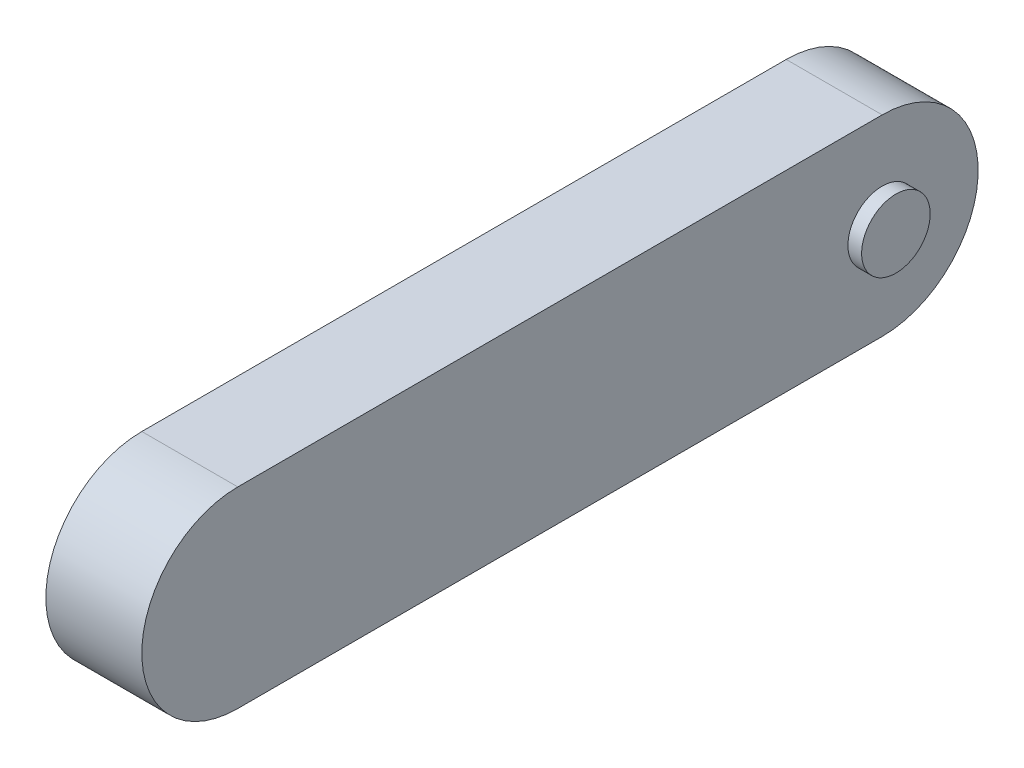
ISO-10303-21;
HEADER;
FILE_DESCRIPTION(('STEP AP214'),'2;1');
FILE_NAME('part.step','',(''),(''),'','','');
FILE_SCHEMA(('AUTOMOTIVE_DESIGN { 1 0 10303 214 1 1 1 1 }'));
ENDSEC;
DATA;
#1=APPLICATION_CONTEXT('core data for automotive mechanical design processes');
#2=APPLICATION_PROTOCOL_DEFINITION('international standard','automotive_design',2000,#1);
#3=PRODUCT_CONTEXT('',#1,'mechanical');
#4=PRODUCT('Part','Part','',(#3));
#5=PRODUCT_RELATED_PRODUCT_CATEGORY('part','',(#4));
#6=PRODUCT_DEFINITION_FORMATION('','',#4);
#7=PRODUCT_DEFINITION_CONTEXT('part definition',#1,'design');
#8=PRODUCT_DEFINITION('design','',#6,#7);
#9=PRODUCT_DEFINITION_SHAPE('','',#8);
#10=(LENGTH_UNIT() NAMED_UNIT(*) SI_UNIT(.MILLI.,.METRE.));
#11=(NAMED_UNIT(*) PLANE_ANGLE_UNIT() SI_UNIT($,.RADIAN.));
#12=(NAMED_UNIT(*) SI_UNIT($,.STERADIAN.) SOLID_ANGLE_UNIT());
#13=UNCERTAINTY_MEASURE_WITH_UNIT(LENGTH_MEASURE(1.E-05),#10,'distance_accuracy_value','');
#14=(GEOMETRIC_REPRESENTATION_CONTEXT(3) GLOBAL_UNCERTAINTY_ASSIGNED_CONTEXT((#13)) GLOBAL_UNIT_ASSIGNED_CONTEXT((#10,
#11,#12)) REPRESENTATION_CONTEXT('',''));
#15=CARTESIAN_POINT('',(0.,0.,0.));
#16=DIRECTION('',(0.,0.,1.));
#17=DIRECTION('',(1.,0.,0.));
#18=AXIS2_PLACEMENT_3D('',#15,#16,#17);
#19=CARTESIAN_POINT('',(70.,0.,0.));
#20=DIRECTION('',(-1.,0.,0.));
#21=DIRECTION('',(0.,0.,1.));
#22=AXIS2_PLACEMENT_3D('',#19,#20,#21);
#23=CYLINDRICAL_SURFACE('',#22,70.);
#24=CARTESIAN_POINT('',(70.,0.,0.));
#25=DIRECTION('',(1.,0.,0.));
#26=DIRECTION('',(0.,0.,-1.));
#27=AXIS2_PLACEMENT_3D('',#24,#25,#26);
#28=CIRCLE('',#27,70.);
#29=CARTESIAN_POINT('',(70.,-70.,0.));
#30=VERTEX_POINT('',#29);
#31=CARTESIAN_POINT('',(70.,70.,0.));
#32=VERTEX_POINT('',#31);
#33=EDGE_CURVE('E68',#30,#32,#28,.T.);
#34=ORIENTED_EDGE('',*,*,#33,.F.);
#35=DIRECTION('',(1.,0.,0.));
#36=VECTOR('',#35,1.);
#37=CARTESIAN_POINT('',(0.,-70.,0.));
#38=LINE('',#37,#36);
#39=CARTESIAN_POINT('',(0.,-70.,0.));
#40=VERTEX_POINT('',#39);
#41=EDGE_CURVE('E103',#40,#30,#38,.T.);
#42=ORIENTED_EDGE('',*,*,#41,.F.);
#43=CARTESIAN_POINT('',(0.,0.,0.));
#44=DIRECTION('',(1.,0.,0.));
#45=DIRECTION('',(0.,0.,-1.));
#46=AXIS2_PLACEMENT_3D('',#43,#44,#45);
#47=CIRCLE('',#46,70.);
#48=CARTESIAN_POINT('',(0.,70.,0.));
#49=VERTEX_POINT('',#48);
#50=EDGE_CURVE('E62',#40,#49,#47,.T.);
#51=ORIENTED_EDGE('',*,*,#50,.T.);
#52=DIRECTION('',(1.,0.,0.));
#53=VECTOR('',#52,1.);
#54=CARTESIAN_POINT('',(0.,70.,0.));
#55=LINE('',#54,#53);
#56=EDGE_CURVE('E133',#49,#32,#55,.T.);
#57=ORIENTED_EDGE('',*,*,#56,.T.);
#58=EDGE_LOOP('',(#34,#42,#51,#57));
#59=FACE_BOUND('',#58,.T.);
#60=ADVANCED_FACE('F59',(#59),#23,.T.);
#61=CARTESIAN_POINT('',(70.,0.,0.));
#62=DIRECTION('',(1.,0.,0.));
#63=DIRECTION('',(0.,0.,-1.));
#64=AXIS2_PLACEMENT_3D('',#61,#62,#63);
#65=PLANE('',#64);
#66=DIRECTION('',(0.,0.,1.));
#67=VECTOR('',#66,1.);
#68=CARTESIAN_POINT('',(70.,-70.,70.));
#69=LINE('',#68,#67);
#70=CARTESIAN_POINT('',(70.,-70.,470.));
#71=VERTEX_POINT('',#70);
#72=EDGE_CURVE('E76',#30,#71,#69,.T.);
#73=ORIENTED_EDGE('',*,*,#72,.F.);
#74=ORIENTED_EDGE('',*,*,#33,.T.);
#75=DIRECTION('',(0.,0.,1.));
#76=VECTOR('',#75,1.);
#77=CARTESIAN_POINT('',(70.,70.,0.));
#78=LINE('',#77,#76);
#79=CARTESIAN_POINT('',(70.0000000000001,70.,470.));
#80=VERTEX_POINT('',#79);
#81=EDGE_CURVE('E105',#32,#80,#78,.T.);
#82=ORIENTED_EDGE('',*,*,#81,.T.);
#83=CARTESIAN_POINT('',(70.,0.,470.));
#84=DIRECTION('',(1.,0.,0.));
#85=DIRECTION('',(0.,0.,-1.));
#86=AXIS2_PLACEMENT_3D('',#83,#84,#85);
#87=CIRCLE('',#86,70.);
#88=EDGE_CURVE('E108',#80,#71,#87,.T.);
#89=ORIENTED_EDGE('',*,*,#88,.T.);
#90=EDGE_LOOP('',(#73,#74,#82,#89));
#91=FACE_BOUND('',#90,.T.);
#92=CARTESIAN_POINT('',(70.,0.,0.));
#93=DIRECTION('',(1.,0.,0.));
#94=DIRECTION('',(0.,0.,-1.));
#95=AXIS2_PLACEMENT_3D('',#92,#93,#94);
#96=CIRCLE('',#95,25.);
#97=CARTESIAN_POINT('',(70.,0.,-25.));
#98=VERTEX_POINT('',#97);
#99=EDGE_CURVE('E12',#98,#98,#96,.T.);
#100=ORIENTED_EDGE('',*,*,#99,.F.);
#101=EDGE_LOOP('',(#100));
#102=FACE_BOUND('',#101,.T.);
#103=ADVANCED_FACE('F109',(#91,#102),#65,.T.);
#104=CARTESIAN_POINT('',(0.,0.,0.));
#105=DIRECTION('',(1.,0.,0.));
#106=DIRECTION('',(0.,0.,-1.));
#107=AXIS2_PLACEMENT_3D('',#104,#105,#106);
#108=PLANE('',#107);
#109=ORIENTED_EDGE('',*,*,#50,.F.);
#110=DIRECTION('',(0.,0.,1.));
#111=VECTOR('',#110,1.);
#112=CARTESIAN_POINT('',(0.,-70.,70.));
#113=LINE('',#112,#111);
#114=CARTESIAN_POINT('',(0.,-70.,470.));
#115=VERTEX_POINT('',#114);
#116=EDGE_CURVE('E84',#40,#115,#113,.T.);
#117=ORIENTED_EDGE('',*,*,#116,.T.);
#118=CARTESIAN_POINT('',(0.,0.,470.));
#119=DIRECTION('',(1.,0.,0.));
#120=DIRECTION('',(0.,0.,-1.));
#121=AXIS2_PLACEMENT_3D('',#118,#119,#120);
#122=CIRCLE('',#121,70.);
#123=CARTESIAN_POINT('',(0.,70.,470.));
#124=VERTEX_POINT('',#123);
#125=EDGE_CURVE('E116',#124,#115,#122,.T.);
#126=ORIENTED_EDGE('',*,*,#125,.F.);
#127=DIRECTION('',(0.,0.,1.));
#128=VECTOR('',#127,1.);
#129=CARTESIAN_POINT('',(0.,70.,0.));
#130=LINE('',#129,#128);
#131=EDGE_CURVE('E130',#49,#124,#130,.T.);
#132=ORIENTED_EDGE('',*,*,#131,.F.);
#133=EDGE_LOOP('',(#109,#117,#126,#132));
#134=FACE_BOUND('',#133,.T.);
#135=CARTESIAN_POINT('',(0.,0.,0.));
#136=DIRECTION('',(1.,0.,0.));
#137=DIRECTION('',(0.,0.,-1.));
#138=AXIS2_PLACEMENT_3D('',#135,#136,#137);
#139=CIRCLE('',#138,25.);
#140=CARTESIAN_POINT('',(0.,0.,-25.));
#141=VERTEX_POINT('',#140);
#142=EDGE_CURVE('E142',#141,#141,#139,.T.);
#143=ORIENTED_EDGE('',*,*,#142,.T.);
#144=EDGE_LOOP('',(#143));
#145=FACE_BOUND('',#144,.T.);
#146=ADVANCED_FACE('F159',(#134,#145),#108,.F.);
#147=CARTESIAN_POINT('',(-10.,0.,0.));
#148=DIRECTION('',(1.,0.,0.));
#149=DIRECTION('',(0.,0.,-1.));
#150=AXIS2_PLACEMENT_3D('',#147,#148,#149);
#151=CYLINDRICAL_SURFACE('',#150,25.);
#152=CARTESIAN_POINT('',(-10.,0.,0.));
#153=DIRECTION('',(1.,0.,0.));
#154=DIRECTION('',(0.,0.,-1.));
#155=AXIS2_PLACEMENT_3D('',#152,#153,#154);
#156=CIRCLE('',#155,25.);
#157=CARTESIAN_POINT('',(-10.,0.,-25.));
#158=VERTEX_POINT('',#157);
#159=EDGE_CURVE('E144',#158,#158,#156,.T.);
#160=ORIENTED_EDGE('',*,*,#159,.T.);
#161=EDGE_LOOP('',(#160));
#162=FACE_BOUND('',#161,.T.);
#163=ORIENTED_EDGE('',*,*,#142,.F.);
#164=EDGE_LOOP('',(#163));
#165=FACE_BOUND('',#164,.T.);
#166=ADVANCED_FACE('F165',(#162,#165),#151,.T.);
#167=CARTESIAN_POINT('',(-10.,0.,0.));
#168=DIRECTION('',(1.,0.,0.));
#169=DIRECTION('',(0.,0.,-1.));
#170=AXIS2_PLACEMENT_3D('',#167,#168,#169);
#171=PLANE('',#170);
#172=ORIENTED_EDGE('',*,*,#159,.F.);
#173=EDGE_LOOP('',(#172));
#174=FACE_BOUND('',#173,.T.);
#175=ADVANCED_FACE('F169',(#174),#171,.F.);
#176=CARTESIAN_POINT('',(80.,0.,0.));
#177=DIRECTION('',(-1.,0.,0.));
#178=DIRECTION('',(0.,0.,1.));
#179=AXIS2_PLACEMENT_3D('',#176,#177,#178);
#180=CYLINDRICAL_SURFACE('',#179,25.);
#181=CARTESIAN_POINT('',(80.,0.,0.));
#182=DIRECTION('',(1.,0.,0.));
#183=DIRECTION('',(0.,0.,-1.));
#184=AXIS2_PLACEMENT_3D('',#181,#182,#183);
#185=CIRCLE('',#184,25.);
#186=CARTESIAN_POINT('',(80.,0.,-25.));
#187=VERTEX_POINT('',#186);
#188=EDGE_CURVE('E139',#187,#187,#185,.T.);
#189=ORIENTED_EDGE('',*,*,#188,.F.);
#190=EDGE_LOOP('',(#189));
#191=FACE_BOUND('',#190,.T.);
#192=ORIENTED_EDGE('',*,*,#99,.T.);
#193=EDGE_LOOP('',(#192));
#194=FACE_BOUND('',#193,.T.);
#195=ADVANCED_FACE('F175',(#191,#194),#180,.T.);
#196=CARTESIAN_POINT('',(80.,0.,0.));
#197=DIRECTION('',(1.,0.,0.));
#198=DIRECTION('',(0.,0.,-1.));
#199=AXIS2_PLACEMENT_3D('',#196,#197,#198);
#200=PLANE('',#199);
#201=ORIENTED_EDGE('',*,*,#188,.T.);
#202=EDGE_LOOP('',(#201));
#203=FACE_BOUND('',#202,.T.);
#204=ADVANCED_FACE('F200',(#203),#200,.T.);
#205=CARTESIAN_POINT('',(0.,70.,0.));
#206=DIRECTION('',(0.,1.,0.));
#207=DIRECTION('',(0.,0.,1.));
#208=AXIS2_PLACEMENT_3D('',#205,#206,#207);
#209=PLANE('',#208);
#210=ORIENTED_EDGE('',*,*,#81,.F.);
#211=ORIENTED_EDGE('',*,*,#56,.F.);
#212=ORIENTED_EDGE('',*,*,#131,.T.);
#213=DIRECTION('',(1.,0.,0.));
#214=VECTOR('',#213,1.);
#215=CARTESIAN_POINT('',(0.,70.,470.));
#216=LINE('',#215,#214);
#217=EDGE_CURVE('E124',#124,#80,#216,.T.);
#218=ORIENTED_EDGE('',*,*,#217,.T.);
#219=EDGE_LOOP('',(#210,#211,#212,#218));
#220=FACE_BOUND('',#219,.T.);
#221=ADVANCED_FACE('F158',(#220),#209,.T.);
#222=CARTESIAN_POINT('',(0.,-70.,0.));
#223=DIRECTION('',(0.,1.,0.));
#224=DIRECTION('',(0.,0.,1.));
#225=AXIS2_PLACEMENT_3D('',#222,#223,#224);
#226=PLANE('',#225);
#227=ORIENTED_EDGE('',*,*,#116,.F.);
#228=ORIENTED_EDGE('',*,*,#41,.T.);
#229=ORIENTED_EDGE('',*,*,#72,.T.);
#230=DIRECTION('',(1.,0.,0.));
#231=VECTOR('',#230,1.);
#232=CARTESIAN_POINT('',(0.,-70.,470.));
#233=LINE('',#232,#231);
#234=EDGE_CURVE('E102',#115,#71,#233,.T.);
#235=ORIENTED_EDGE('',*,*,#234,.F.);
#236=EDGE_LOOP('',(#227,#228,#229,#235));
#237=FACE_BOUND('',#236,.T.);
#238=ADVANCED_FACE('F100',(#237),#226,.F.);
#239=CARTESIAN_POINT('',(70.,0.,470.));
#240=DIRECTION('',(-1.,0.,0.));
#241=DIRECTION('',(0.,0.,1.));
#242=AXIS2_PLACEMENT_3D('',#239,#240,#241);
#243=CYLINDRICAL_SURFACE('',#242,70.);
#244=ORIENTED_EDGE('',*,*,#125,.T.);
#245=ORIENTED_EDGE('',*,*,#234,.T.);
#246=ORIENTED_EDGE('',*,*,#88,.F.);
#247=ORIENTED_EDGE('',*,*,#217,.F.);
#248=EDGE_LOOP('',(#244,#245,#246,#247));
#249=FACE_BOUND('',#248,.T.);
#250=ADVANCED_FACE('F119',(#249),#243,.T.);
#251=CLOSED_SHELL('',(#60,#103,#146,#166,#175,#195,#204,#221,#238,#250));
#252=MANIFOLD_SOLID_BREP('B2',#251);
#253=ADVANCED_BREP_SHAPE_REPRESENTATION('',(#18,#252),#14);
#254=SHAPE_DEFINITION_REPRESENTATION(#9,#253);
ENDSEC;
END-ISO-10303-21;
